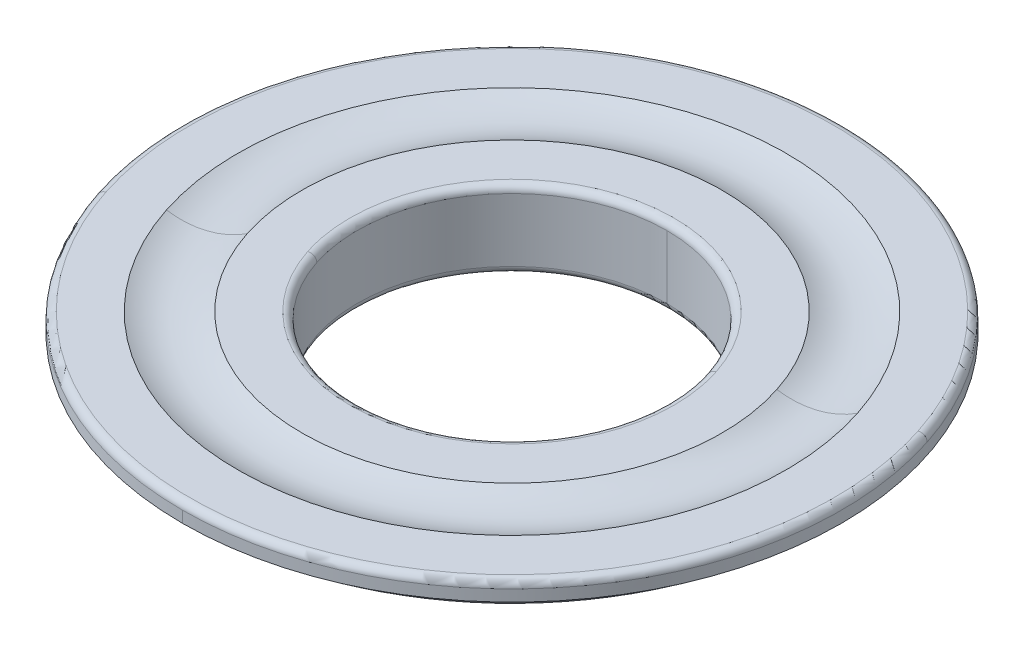
ISO-10303-21;
HEADER;
FILE_DESCRIPTION(('STEP AP214'),'2;1');
FILE_NAME('part.step','',(''),(''),'','','');
FILE_SCHEMA(('AUTOMOTIVE_DESIGN { 1 0 10303 214 1 1 1 1 }'));
ENDSEC;
DATA;
#1=APPLICATION_CONTEXT('core data for automotive mechanical design processes');
#2=APPLICATION_PROTOCOL_DEFINITION('international standard','automotive_design',2000,#1);
#3=PRODUCT_CONTEXT('',#1,'mechanical');
#4=PRODUCT('Part','Part','',(#3));
#5=PRODUCT_RELATED_PRODUCT_CATEGORY('part','',(#4));
#6=PRODUCT_DEFINITION_FORMATION('','',#4);
#7=PRODUCT_DEFINITION_CONTEXT('part definition',#1,'design');
#8=PRODUCT_DEFINITION('design','',#6,#7);
#9=PRODUCT_DEFINITION_SHAPE('','',#8);
#10=(LENGTH_UNIT() NAMED_UNIT(*) SI_UNIT(.MILLI.,.METRE.));
#11=(NAMED_UNIT(*) PLANE_ANGLE_UNIT() SI_UNIT($,.RADIAN.));
#12=(NAMED_UNIT(*) SI_UNIT($,.STERADIAN.) SOLID_ANGLE_UNIT());
#13=UNCERTAINTY_MEASURE_WITH_UNIT(LENGTH_MEASURE(1.E-05),#10,'distance_accuracy_value','');
#14=(GEOMETRIC_REPRESENTATION_CONTEXT(3) GLOBAL_UNCERTAINTY_ASSIGNED_CONTEXT((#13)) GLOBAL_UNIT_ASSIGNED_CONTEXT((#10,
#11,#12)) REPRESENTATION_CONTEXT('',''));
#15=CARTESIAN_POINT('',(0.,0.,0.));
#16=DIRECTION('',(0.,0.,1.));
#17=DIRECTION('',(1.,0.,0.));
#18=AXIS2_PLACEMENT_3D('',#15,#16,#17);
#19=CARTESIAN_POINT('',(-36.083791375076,0.,0.));
#20=DIRECTION('',(0.,-1.,0.));
#21=DIRECTION('',(0.,0.,-1.));
#22=AXIS2_PLACEMENT_3D('',#19,#20,#21);
#23=PLANE('',#22);
#24=CARTESIAN_POINT('',(0.,0.,0.));
#25=DIRECTION('',(0.,1.,0.));
#26=DIRECTION('',(0.,0.,1.));
#27=AXIS2_PLACEMENT_3D('',#24,#25,#26);
#28=CIRCLE('',#27,24.6);
#29=CARTESIAN_POINT('',(23.3959903008611,0.,-7.60181806162381));
#30=VERTEX_POINT('',#29);
#31=CARTESIAN_POINT('',(-23.3959903008611,0.,7.60181806162381));
#32=VERTEX_POINT('',#31);
#33=EDGE_CURVE('E11',#30,#32,#28,.T.);
#34=ORIENTED_EDGE('',*,*,#33,.T.);
#35=CARTESIAN_POINT('',(-23.3959903008608,0.,7.6018180616237));
#36=CARTESIAN_POINT('',(-22.2018510126811,0.,11.2768172380102));
#37=CARTESIAN_POINT('',(-20.286424526131,0.,14.7175705841354));
#38=CARTESIAN_POINT('',(-17.7097835020012,0.,17.734267025429));
#39=CARTESIAN_POINT('',(-11.512552889599,0.,22.5946486259766));
#40=CARTESIAN_POINT('',(-3.93777589317228,0.,24.7514777027532));
#41=CARTESIAN_POINT('',(0.0173134109549208,0.,25.0627567260904));
#42=CARTESIAN_POINT('',(7.83622344692157,0.,24.1174158962172));
#43=CARTESIAN_POINT('',(14.7175119416968,0.,20.2863726849183));
#44=CARTESIAN_POINT('',(17.7342811837407,0.,17.7097995005804));
#45=CARTESIAN_POINT('',(22.5946521794054,0.,11.5125459156023));
#46=CARTESIAN_POINT('',(24.7514564375839,0.,3.93777384258645));
#47=CARTESIAN_POINT('',(25.0628331356729,0.,-0.0172964397257402));
#48=CARTESIAN_POINT('',(24.5900216411396,0.,-3.92678381083807));
#49=CARTESIAN_POINT('',(23.3959903008608,0.,-7.6018180616237));
#50=B_SPLINE_CURVE_WITH_KNOTS('',5,(#35,#36,#37,#38,#39,#40,#41,#42,#43,#44,#45,#46,#47,#48,
#49),.UNSPECIFIED.,.F.,.F.,(6,3,3,3,6),(0.,0.785398163397448,1.5707963267949,2.35619449019234,
3.14159265358979),.UNSPECIFIED.);
#51=EDGE_CURVE('E26',#32,#30,#50,.T.);
#52=ORIENTED_EDGE('',*,*,#51,.T.);
#53=EDGE_LOOP('',(#34,#52));
#54=FACE_BOUND('',#53,.T.);
#55=CARTESIAN_POINT('',(0.,0.,0.));
#56=DIRECTION('',(0.,1.,0.));
#57=DIRECTION('',(0.,0.,1.));
#58=AXIS2_PLACEMENT_3D('',#55,#56,#57);
#59=CIRCLE('',#58,36.083791375076);
#60=CARTESIAN_POINT('',(36.0837913750529,7.67386154620908E-12,0.));
#61=VERTEX_POINT('',#60);
#62=CARTESIAN_POINT('',(-36.0837913750913,7.67386154620908E-12,0.));
#63=VERTEX_POINT('',#62);
#64=EDGE_CURVE('E393',#61,#63,#59,.T.);
#65=ORIENTED_EDGE('',*,*,#64,.F.);
#66=CARTESIAN_POINT('',(0.,0.,0.));
#67=DIRECTION('',(0.,1.,0.));
#68=DIRECTION('',(-1.,0.,0.));
#69=AXIS2_PLACEMENT_3D('',#66,#67,#68);
#70=CIRCLE('',#69,36.083791375076);
#71=EDGE_CURVE('E388',#63,#61,#70,.T.);
#72=ORIENTED_EDGE('',*,*,#71,.F.);
#73=EDGE_LOOP('',(#65,#72));
#74=FACE_BOUND('',#73,.T.);
#75=ADVANCED_FACE('F17',(#54,#74),#23,.T.);
#76=CARTESIAN_POINT('',(-1.92068583260152E-11,71.3999999999698,0.));
#77=DIRECTION('',(0.,1.,0.));
#78=DIRECTION('',(0.,0.,-1.));
#79=AXIS2_PLACEMENT_3D('',#76,#77,#78);
#80=SPHERICAL_SURFACE('',#79,79.9999999999645);
#81=CARTESIAN_POINT('',(-1.92068583260152E-11,71.3999999999698,0.));
#82=DIRECTION('',(0.,0.,-1.));
#83=DIRECTION('',(0.625000000000184,-0.780624749799652,0.));
#84=AXIS2_PLACEMENT_3D('',#81,#82,#83);
#85=CIRCLE('',#84,79.9999999999645);
#86=CARTESIAN_POINT('',(49.9999999999733,8.95002001602532,0.));
#87=VERTEX_POINT('',#86);
#88=EDGE_CURVE('E383',#87,#61,#85,.T.);
#89=ORIENTED_EDGE('',*,*,#88,.F.);
#90=CARTESIAN_POINT('',(0.,8.950020016016,0.));
#91=DIRECTION('',(0.,1.,0.));
#92=DIRECTION('',(0.,0.,1.));
#93=AXIS2_PLACEMENT_3D('',#90,#91,#92);
#94=CIRCLE('',#93,50.);
#95=CARTESIAN_POINT('',(0.,8.950020016016,50.));
#96=VERTEX_POINT('',#95);
#97=EDGE_CURVE('E378',#96,#87,#94,.T.);
#98=ORIENTED_EDGE('',*,*,#97,.F.);
#99=CARTESIAN_POINT('',(0.,8.950020016016,0.));
#100=DIRECTION('',(0.,1.,0.));
#101=DIRECTION('',(0.,0.,1.));
#102=AXIS2_PLACEMENT_3D('',#99,#100,#101);
#103=CIRCLE('',#102,50.);
#104=CARTESIAN_POINT('',(-50.0000000000118,8.95002001602532,0.));
#105=VERTEX_POINT('',#104);
#106=EDGE_CURVE('E373',#105,#96,#103,.T.);
#107=ORIENTED_EDGE('',*,*,#106,.F.);
#108=CARTESIAN_POINT('',(-1.92068583260152E-11,71.3999999999698,0.));
#109=DIRECTION('',(0.,0.,1.));
#110=DIRECTION('',(-0.625000000000184,-0.780624749799652,0.));
#111=AXIS2_PLACEMENT_3D('',#108,#109,#110);
#112=CIRCLE('',#111,79.9999999999645);
#113=EDGE_CURVE('E368',#105,#63,#112,.T.);
#114=ORIENTED_EDGE('',*,*,#113,.T.);
#115=ORIENTED_EDGE('',*,*,#71,.T.);
#116=EDGE_LOOP('',(#89,#98,#107,#114,#115));
#117=FACE_BOUND('',#116,.T.);
#118=ADVANCED_FACE('F413',(#117),#80,.T.);
#119=CARTESIAN_POINT('',(-1.92068583260152E-11,71.3999999999698,0.));
#120=DIRECTION('',(0.,1.,0.));
#121=DIRECTION('',(0.,0.,1.));
#122=AXIS2_PLACEMENT_3D('',#119,#120,#121);
#123=SPHERICAL_SURFACE('',#122,79.9999999999645);
#124=ORIENTED_EDGE('',*,*,#88,.T.);
#125=ORIENTED_EDGE('',*,*,#64,.T.);
#126=ORIENTED_EDGE('',*,*,#113,.F.);
#127=CARTESIAN_POINT('',(0.,8.950020016016,0.));
#128=DIRECTION('',(0.,1.,0.));
#129=DIRECTION('',(0.,0.,1.));
#130=AXIS2_PLACEMENT_3D('',#127,#128,#129);
#131=CIRCLE('',#130,50.);
#132=CARTESIAN_POINT('',(0.,8.950020016016,-50.));
#133=VERTEX_POINT('',#132);
#134=EDGE_CURVE('E363',#133,#105,#131,.T.);
#135=ORIENTED_EDGE('',*,*,#134,.F.);
#136=CARTESIAN_POINT('',(0.,8.950020016016,0.));
#137=DIRECTION('',(0.,1.,0.));
#138=DIRECTION('',(0.,0.,1.));
#139=AXIS2_PLACEMENT_3D('',#136,#137,#138);
#140=CIRCLE('',#139,50.);
#141=EDGE_CURVE('E358',#87,#133,#140,.T.);
#142=ORIENTED_EDGE('',*,*,#141,.F.);
#143=EDGE_LOOP('',(#124,#125,#126,#135,#142));
#144=FACE_BOUND('',#143,.T.);
#145=ADVANCED_FACE('F409',(#144),#123,.T.);
#146=CARTESIAN_POINT('',(0.,11.777777777778,0.));
#147=DIRECTION('',(0.,1.,0.));
#148=DIRECTION('',(-1.,0.,0.));
#149=AXIS2_PLACEMENT_3D('',#146,#147,#148);
#150=CYLINDRICAL_SURFACE('',#149,50.);
#151=DIRECTION('',(0.,1.,0.));
#152=VECTOR('',#151,1.);
#153=CARTESIAN_POINT('',(0.,8.950020016016,-50.));
#154=LINE('',#153,#152);
#155=CARTESIAN_POINT('',(0.,10.677777777778,-50.));
#156=VERTEX_POINT('',#155);
#157=EDGE_CURVE('E354',#133,#156,#154,.T.);
#158=ORIENTED_EDGE('',*,*,#157,.T.);
#159=CARTESIAN_POINT('',(0.,10.677777777778,0.));
#160=DIRECTION('',(0.,1.,0.));
#161=DIRECTION('',(0.,0.,1.));
#162=AXIS2_PLACEMENT_3D('',#159,#160,#161);
#163=CIRCLE('',#162,50.);
#164=CARTESIAN_POINT('',(47.5528258147577,10.677777777778,-15.4508497187474));
#165=VERTEX_POINT('',#164);
#166=EDGE_CURVE('E349',#165,#156,#163,.T.);
#167=ORIENTED_EDGE('',*,*,#166,.F.);
#168=CARTESIAN_POINT('',(0.,10.677777777778,0.));
#169=DIRECTION('',(0.,1.,0.));
#170=DIRECTION('',(0.,0.,1.));
#171=AXIS2_PLACEMENT_3D('',#168,#169,#170);
#172=CIRCLE('',#171,50.);
#173=CARTESIAN_POINT('',(0.,10.677777777778,50.));
#174=VERTEX_POINT('',#173);
#175=EDGE_CURVE('E344',#174,#165,#172,.T.);
#176=ORIENTED_EDGE('',*,*,#175,.F.);
#177=DIRECTION('',(0.,1.,0.));
#178=VECTOR('',#177,1.);
#179=CARTESIAN_POINT('',(0.,8.950020016016,50.));
#180=LINE('',#179,#178);
#181=EDGE_CURVE('E339',#96,#174,#180,.T.);
#182=ORIENTED_EDGE('',*,*,#181,.F.);
#183=ORIENTED_EDGE('',*,*,#97,.T.);
#184=ORIENTED_EDGE('',*,*,#141,.T.);
#185=EDGE_LOOP('',(#158,#167,#176,#182,#183,#184));
#186=FACE_BOUND('',#185,.T.);
#187=ADVANCED_FACE('F420',(#186),#150,.T.);
#188=CARTESIAN_POINT('',(0.,11.777777777778,0.));
#189=DIRECTION('',(0.,1.,0.));
#190=DIRECTION('',(1.,0.,0.));
#191=AXIS2_PLACEMENT_3D('',#188,#189,#190);
#192=CYLINDRICAL_SURFACE('',#191,50.);
#193=ORIENTED_EDGE('',*,*,#157,.F.);
#194=ORIENTED_EDGE('',*,*,#134,.T.);
#195=ORIENTED_EDGE('',*,*,#106,.T.);
#196=ORIENTED_EDGE('',*,*,#181,.T.);
#197=CARTESIAN_POINT('',(0.,10.677777777778,0.));
#198=DIRECTION('',(0.,1.,0.));
#199=DIRECTION('',(0.,0.,1.));
#200=AXIS2_PLACEMENT_3D('',#197,#198,#199);
#201=CIRCLE('',#200,50.);
#202=CARTESIAN_POINT('',(-47.5528258147577,10.677777777778,15.4508497187474));
#203=VERTEX_POINT('',#202);
#204=EDGE_CURVE('E334',#203,#174,#201,.T.);
#205=ORIENTED_EDGE('',*,*,#204,.F.);
#206=CARTESIAN_POINT('',(0.,10.677777777778,0.));
#207=DIRECTION('',(0.,1.,0.));
#208=DIRECTION('',(0.,0.,1.));
#209=AXIS2_PLACEMENT_3D('',#206,#207,#208);
#210=CIRCLE('',#209,50.);
#211=EDGE_CURVE('E329',#156,#203,#210,.T.);
#212=ORIENTED_EDGE('',*,*,#211,.F.);
#213=EDGE_LOOP('',(#193,#194,#195,#196,#205,#212));
#214=FACE_BOUND('',#213,.T.);
#215=ADVANCED_FACE('F417',(#214),#192,.T.);
#216=CARTESIAN_POINT('',(0.,10.6777777777773,0.));
#217=DIRECTION('',(0.,1.,0.));
#218=DIRECTION('',(0.309016994374947,0.,0.951056516295154));
#219=AXIS2_PLACEMENT_3D('',#216,#217,#218);
#220=TOROIDAL_SURFACE('',#219,48.8999999999993,1.1000000000007);
#221=CARTESIAN_POINT('',(-46.5066636468323,10.6777777777773,15.1109310249347));
#222=DIRECTION('',(0.309016994374947,0.,0.951056516295154));
#223=DIRECTION('',(0.,1.,0.));
#224=AXIS2_PLACEMENT_3D('',#221,#222,#223);
#225=CIRCLE('',#224,1.1000000000007);
#226=CARTESIAN_POINT('',(-46.5066636468323,11.777777777778,15.1109310249347));
#227=VERTEX_POINT('',#226);
#228=EDGE_CURVE('E325',#227,#203,#225,.T.);
#229=ORIENTED_EDGE('',*,*,#228,.F.);
#230=CARTESIAN_POINT('',(0.,11.777777777778,0.));
#231=DIRECTION('',(0.,1.,0.));
#232=DIRECTION('',(0.,0.,1.));
#233=AXIS2_PLACEMENT_3D('',#230,#231,#232);
#234=CIRCLE('',#233,48.9);
#235=CARTESIAN_POINT('',(46.5066636468323,11.777777777778,-15.1109310249347));
#236=VERTEX_POINT('',#235);
#237=EDGE_CURVE('E321',#236,#227,#234,.T.);
#238=ORIENTED_EDGE('',*,*,#237,.F.);
#239=CARTESIAN_POINT('',(46.5066636468323,10.6777777777773,-15.1109310249347));
#240=DIRECTION('',(-0.309016994374947,0.,-0.951056516295154));
#241=DIRECTION('',(0.,1.,0.));
#242=AXIS2_PLACEMENT_3D('',#239,#240,#241);
#243=CIRCLE('',#242,1.1000000000007);
#244=EDGE_CURVE('E318',#236,#165,#243,.T.);
#245=ORIENTED_EDGE('',*,*,#244,.T.);
#246=ORIENTED_EDGE('',*,*,#166,.T.);
#247=ORIENTED_EDGE('',*,*,#211,.T.);
#248=EDGE_LOOP('',(#229,#238,#245,#246,#247));
#249=FACE_BOUND('',#248,.T.);
#250=ADVANCED_FACE('F302',(#249),#220,.T.);
#251=CARTESIAN_POINT('',(0.,10.6777777777773,0.));
#252=DIRECTION('',(0.,1.,0.));
#253=DIRECTION('',(-0.309016994374947,0.,-0.951056516295154));
#254=AXIS2_PLACEMENT_3D('',#251,#252,#253);
#255=TOROIDAL_SURFACE('',#254,48.8999999999993,1.1000000000007);
#256=ORIENTED_EDGE('',*,*,#228,.T.);
#257=ORIENTED_EDGE('',*,*,#204,.T.);
#258=ORIENTED_EDGE('',*,*,#175,.T.);
#259=ORIENTED_EDGE('',*,*,#244,.F.);
#260=CARTESIAN_POINT('',(-46.506663646833,11.777777777778,15.1109310249349));
#261=CARTESIAN_POINT('',(-44.1329477447198,11.777777777778,22.4161123145812));
#262=CARTESIAN_POINT('',(-40.3254536312116,11.777777777778,29.2556586001716));
#263=CARTESIAN_POINT('',(-35.2035940344658,11.777777777778,35.2522625017673));
#264=CARTESIAN_POINT('',(-22.8847087927394,11.777777777778,44.9137527565145));
#265=CARTESIAN_POINT('',(-7.82753012911076,11.777777777778,49.2011081164484));
#266=CARTESIAN_POINT('',(0.0344156827518094,11.777777777778,49.8198700774724));
#267=CARTESIAN_POINT('',(15.5768831932709,11.777777777778,47.9407169644317));
#268=CARTESIAN_POINT('',(29.2555420304461,11.777777777778,40.3253505809962));
#269=CARTESIAN_POINT('',(35.2522906457284,11.777777777778,35.2036258365196));
#270=CARTESIAN_POINT('',(44.9137598200377,11.777777777778,22.8846949297948));
#271=CARTESIAN_POINT('',(49.2010658454412,11.777777777778,7.82752605294624));
#272=CARTESIAN_POINT('',(49.8200219648134,11.777777777778,-0.0343819472596962));
#273=CARTESIAN_POINT('',(48.8801649695824,11.777777777778,-7.80568001422689));
#274=CARTESIAN_POINT('',(46.506663646833,11.777777777778,-15.1109310249349));
#275=B_SPLINE_CURVE_WITH_KNOTS('',5,(#260,#261,#262,#263,#264,#265,#266,#267,#268,#269,#270,
#271,#272,#273,#274),.UNSPECIFIED.,.F.,.F.,(6,3,3,3,6),(0.,0.785398163397448,1.5707963267949,
2.35619449019234,3.14159265358979),.UNSPECIFIED.);
#276=EDGE_CURVE('E277',#227,#236,#275,.T.);
#277=ORIENTED_EDGE('',*,*,#276,.F.);
#278=EDGE_LOOP('',(#256,#257,#258,#259,#277));
#279=FACE_BOUND('',#278,.T.);
#280=ADVANCED_FACE('F297',(#279),#255,.T.);
#281=CARTESIAN_POINT('',(-41.606102181283,11.777777777778,0.));
#282=DIRECTION('',(0.,1.,0.));
#283=DIRECTION('',(0.,0.,1.));
#284=AXIS2_PLACEMENT_3D('',#281,#282,#283);
#285=PLANE('',#284);
#286=ORIENTED_EDGE('',*,*,#237,.T.);
#287=ORIENTED_EDGE('',*,*,#276,.T.);
#288=EDGE_LOOP('',(#286,#287));
#289=FACE_BOUND('',#288,.T.);
#290=CARTESIAN_POINT('',(0.,11.777777777778,0.));
#291=DIRECTION('',(0.,1.,0.));
#292=DIRECTION('',(-0.951056516295154,0.,0.309016994374947));
#293=AXIS2_PLACEMENT_3D('',#290,#291,#292);
#294=CIRCLE('',#293,41.606102181283);
#295=CARTESIAN_POINT('',(-39.5697545971512,11.777777777778,12.856992643717));
#296=VERTEX_POINT('',#295);
#297=CARTESIAN_POINT('',(39.5697545971512,11.777777777778,-12.856992643717));
#298=VERTEX_POINT('',#297);
#299=EDGE_CURVE('E272',#296,#298,#294,.T.);
#300=ORIENTED_EDGE('',*,*,#299,.F.);
#301=CARTESIAN_POINT('',(0.,11.777777777778,0.));
#302=DIRECTION('',(0.,1.,0.));
#303=DIRECTION('',(0.,0.,1.));
#304=AXIS2_PLACEMENT_3D('',#301,#302,#303);
#305=CIRCLE('',#304,41.606102181283);
#306=EDGE_CURVE('E267',#298,#296,#305,.T.);
#307=ORIENTED_EDGE('',*,*,#306,.F.);
#308=EDGE_LOOP('',(#300,#307));
#309=FACE_BOUND('',#308,.T.);
#310=ADVANCED_FACE('F286',(#289,#309),#285,.T.);
#311=CARTESIAN_POINT('',(0.,21.1999999999982,0.));
#312=DIRECTION('',(0.,1.,0.));
#313=DIRECTION('',(0.309016994374947,0.,0.951056516295154));
#314=AXIS2_PLACEMENT_3D('',#311,#312,#313);
#315=TOROIDAL_SURFACE('',#314,36.75,10.5999999999981);
#316=CARTESIAN_POINT('',(-34.9513269738469,21.1999999999982,11.3563745432793));
#317=DIRECTION('',(0.309016994374947,0.,0.951056516295154));
#318=DIRECTION('',(-0.435700719179726,-0.88888888888885,0.141567745324335));
#319=AXIS2_PLACEMENT_3D('',#316,#317,#318);
#320=CIRCLE('',#319,10.5999999999981);
#321=CARTESIAN_POINT('',(-30.3328993505426,11.777777777778,9.85575644284161));
#322=VERTEX_POINT('',#321);
#323=EDGE_CURVE('E263',#296,#322,#320,.T.);
#324=ORIENTED_EDGE('',*,*,#323,.T.);
#325=CARTESIAN_POINT('',(0.,11.777777777778,0.));
#326=DIRECTION('',(0.,1.,0.));
#327=DIRECTION('',(0.,0.,1.));
#328=AXIS2_PLACEMENT_3D('',#325,#326,#327);
#329=CIRCLE('',#328,31.893897818717);
#330=CARTESIAN_POINT('',(30.3328993505426,11.777777777778,-9.85575644284162));
#331=VERTEX_POINT('',#330);
#332=EDGE_CURVE('E258',#331,#322,#329,.T.);
#333=ORIENTED_EDGE('',*,*,#332,.F.);
#334=CARTESIAN_POINT('',(34.9513269738469,21.1999999999982,-11.3563745432793));
#335=DIRECTION('',(-0.309016994374947,0.,-0.951056516295154));
#336=DIRECTION('',(0.435700719179727,-0.888888888888849,-0.141567745324335));
#337=AXIS2_PLACEMENT_3D('',#334,#335,#336);
#338=CIRCLE('',#337,10.5999999999981);
#339=EDGE_CURVE('E253',#298,#331,#338,.T.);
#340=ORIENTED_EDGE('',*,*,#339,.F.);
#341=ORIENTED_EDGE('',*,*,#306,.T.);
#342=EDGE_LOOP('',(#324,#333,#340,#341));
#343=FACE_BOUND('',#342,.T.);
#344=ADVANCED_FACE('F296',(#343),#315,.F.);
#345=CARTESIAN_POINT('',(0.,21.1999999999982,0.));
#346=DIRECTION('',(0.,1.,0.));
#347=DIRECTION('',(-0.309016994374947,0.,-0.951056516295154));
#348=AXIS2_PLACEMENT_3D('',#345,#346,#347);
#349=TOROIDAL_SURFACE('',#348,36.75,10.5999999999981);
#350=ORIENTED_EDGE('',*,*,#323,.F.);
#351=ORIENTED_EDGE('',*,*,#299,.T.);
#352=ORIENTED_EDGE('',*,*,#339,.T.);
#353=CARTESIAN_POINT('',(0.,11.777777777778,0.));
#354=DIRECTION('',(0.,1.,0.));
#355=DIRECTION('',(-0.951056516295154,0.,0.309016994374947));
#356=AXIS2_PLACEMENT_3D('',#353,#354,#355);
#357=CIRCLE('',#356,31.893897818717);
#358=EDGE_CURVE('E250',#322,#331,#357,.T.);
#359=ORIENTED_EDGE('',*,*,#358,.F.);
#360=EDGE_LOOP('',(#350,#351,#352,#359));
#361=FACE_BOUND('',#360,.T.);
#362=ADVANCED_FACE('F427',(#361),#349,.F.);
#363=CARTESIAN_POINT('',(-24.6,11.777777777778,0.));
#364=DIRECTION('',(0.,1.,0.));
#365=DIRECTION('',(0.,0.,1.));
#366=AXIS2_PLACEMENT_3D('',#363,#364,#365);
#367=PLANE('',#366);
#368=ORIENTED_EDGE('',*,*,#332,.T.);
#369=ORIENTED_EDGE('',*,*,#358,.T.);
#370=EDGE_LOOP('',(#368,#369));
#371=FACE_BOUND('',#370,.T.);
#372=CARTESIAN_POINT('',(-23.3959903008614,11.777777777778,7.60181806162396));
#373=CARTESIAN_POINT('',(-23.2716138385705,11.777777777778,7.98463708281952));
#374=CARTESIAN_POINT('',(-23.1378259307744,11.777777777778,8.36439737607865));
#375=CARTESIAN_POINT('',(-22.8517846151789,11.777777777778,9.1168989669184));
#376=CARTESIAN_POINT('',(-22.6995312073796,11.777777777778,9.48964026449902));
#377=CARTESIAN_POINT('',(-22.3769162827848,11.777777777778,10.2272023241761));
#378=CARTESIAN_POINT('',(-22.2065547659893,11.777777777778,10.5920230862726));
#379=CARTESIAN_POINT('',(-21.8481365581518,11.777777777778,11.3128661472931));
#380=CARTESIAN_POINT('',(-21.6600798671097,11.777777777778,11.668888446217));
#381=CARTESIAN_POINT('',(-21.2667236808731,11.777777777778,12.3712766354339));
#382=CARTESIAN_POINT('',(-21.0614241856787,11.777777777778,12.7176425257268));
#383=CARTESIAN_POINT('',(-20.6340771564548,11.777777777778,13.3998835406579));
#384=CARTESIAN_POINT('',(-20.4120296224254,11.777777777778,13.735758665296));
#385=CARTESIAN_POINT('',(-19.951721399031,11.777777777778,14.3962089779033));
#386=CARTESIAN_POINT('',(-19.7134607096662,11.777777777778,14.7207841658724));
#387=CARTESIAN_POINT('',(-19.2213001794554,11.777777777778,15.3578526800199));
#388=CARTESIAN_POINT('',(-18.9674003386095,11.777777777778,15.6703460061982));
#389=CARTESIAN_POINT('',(-18.4445731689131,11.777777777778,16.2824979716478));
#390=CARTESIAN_POINT('',(-18.1756458400625,11.777777777778,16.582156610919));
#391=CARTESIAN_POINT('',(-17.6234115647795,11.777777777778,17.1679172989995));
#392=CARTESIAN_POINT('',(-17.3401046183471,11.777777777778,17.4540193478089));
#393=CARTESIAN_POINT('',(-16.7597936188991,11.777777777778,18.0119776099757));
#394=CARTESIAN_POINT('',(-16.4627895658837,11.777777777778,18.2838338233332));
#395=CARTESIAN_POINT('',(-15.8557998621149,11.777777777778,18.8126454891919));
#396=CARTESIAN_POINT('',(-15.5458142113615,11.777777777778,19.0696009416931));
#397=CARTESIAN_POINT('',(-14.9136080946832,11.777777777778,19.5679920576407));
#398=CARTESIAN_POINT('',(-14.5913876287582,11.777777777778,19.8094277210871));
#399=CARTESIAN_POINT('',(-13.9354881390671,11.777777777778,20.2761976192665));
#400=CARTESIAN_POINT('',(-13.6018091153009,11.777777777778,20.5015318539995));
#401=CARTESIAN_POINT('',(-12.9237963719211,11.777777777778,20.935556044843));
#402=CARTESIAN_POINT('',(-12.5794626523075,11.777777777778,21.1442460009536));
#403=CARTESIAN_POINT('',(-11.8809700473238,11.777777777778,21.5444788821692));
#404=CARTESIAN_POINT('',(-11.5268111619537,11.777777777778,21.7360218072742));
#405=CARTESIAN_POINT('',(-10.8095214252326,11.777777777778,22.1014991827948));
#406=CARTESIAN_POINT('',(-10.4463905738815,11.777777777778,22.2754336332104));
#407=CARTESIAN_POINT('',(-9.71203171922568,11.777777777778,22.6052750360263));
#408=CARTESIAN_POINT('',(-9.34080371592098,11.777777777778,22.7611819884266));
#409=CARTESIAN_POINT('',(-8.59114487813367,11.777777777778,23.0545928017078));
#410=CARTESIAN_POINT('',(-8.21271404365106,11.777777777778,23.1920966625887));
#411=CARTESIAN_POINT('',(-7.44956121653482,11.777777777778,23.4483700339862));
#412=CARTESIAN_POINT('',(-7.0648392239012,11.777777777778,23.5671395445028));
#413=CARTESIAN_POINT('',(-6.29003090946084,11.777777777778,23.785658089018));
#414=CARTESIAN_POINT('',(-5.89994458765412,11.777777777778,23.8854071230166));
#415=CARTESIAN_POINT('',(-5.11534736698433,11.777777777778,24.0656444103358));
#416=CARTESIAN_POINT('',(-4.72083646812127,11.777777777778,24.1461326636564));
#417=CARTESIAN_POINT('',(-3.92834050464924,11.777777777778,24.2876544863676));
#418=CARTESIAN_POINT('',(-3.53035544004028,11.777777777778,24.3486880557581));
#419=CARTESIAN_POINT('',(-2.73186992595646,11.777777777778,24.4511534753945));
#420=CARTESIAN_POINT('',(-2.3313694764816,11.777777777778,24.4925853256403));
#421=CARTESIAN_POINT('',(-1.52881803332849,11.777777777778,24.555747494031));
#422=CARTESIAN_POINT('',(-1.12676703965023,11.777777777778,24.5774778121759));
#423=CARTESIAN_POINT('',(-0.322083084149601,11.777777777778,24.601184566125));
#424=CARTESIAN_POINT('',(0.0805498776727745,11.777777777778,24.6031610019291));
#425=CARTESIAN_POINT('',(0.885427791390145,11.777777777778,24.5873552297898));
#426=CARTESIAN_POINT('',(1.28767274328514,11.777777777778,24.5695730218464));
#427=CARTESIAN_POINT('',(2.09080559382612,11.777777777778,24.5142928011082));
#428=CARTESIAN_POINT('',(2.49169349247211,11.777777777778,24.4767947883135));
#429=CARTESIAN_POINT('',(3.29114646245362,11.777777777778,24.3821732938702));
#430=CARTESIAN_POINT('',(3.68971153378915,11.777777777778,24.3250498122216));
#431=CARTESIAN_POINT('',(4.4835586709827,11.777777777778,24.1913149955412));
#432=CARTESIAN_POINT('',(4.87884073684073,11.777777777778,24.1147036605094));
#433=CARTESIAN_POINT('',(5.66516959396002,11.777777777778,23.9421777004789));
#434=CARTESIAN_POINT('',(6.05621638522129,11.777777777778,23.8462630754804));
#435=CARTESIAN_POINT('',(6.83313262717524,11.777777777778,23.6353616022492));
#436=CARTESIAN_POINT('',(7.21900207786793,11.777777777778,23.5203747540165));
#437=CARTESIAN_POINT('',(7.98463404537986,11.777777777778,23.2716058477064));
#438=CARTESIAN_POINT('',(8.36439656219909,11.777777777778,23.1378237896288));
#439=CARTESIAN_POINT('',(9.11689978079782,11.777777777778,22.8517867563245));
#440=CARTESIAN_POINT('',(9.48964048257731,11.777777777778,22.6995317810978));
#441=CARTESIAN_POINT('',(10.2272021060977,11.777777777778,22.3769157090666));
#442=CARTESIAN_POINT('',(10.5920230278387,11.777777777778,22.206554612262));
#443=CARTESIAN_POINT('',(11.3128662057269,11.777777777778,21.8481367118792));
#444=CARTESIAN_POINT('',(11.6688884618743,11.777777777778,21.6600799083008));
#445=CARTESIAN_POINT('',(12.3712766197765,11.777777777778,21.2667236396821));
#446=CARTESIAN_POINT('',(12.7176425215314,11.777777777778,21.0614241746416));
#447=CARTESIAN_POINT('',(13.3998835448532,11.777777777778,20.634077167492));
#448=CARTESIAN_POINT('',(13.7357586664201,11.777777777778,20.4120296253828));
#449=CARTESIAN_POINT('',(14.3962089767791,11.777777777778,19.9517213960737));
#450=CARTESIAN_POINT('',(14.7207841655711,11.777777777778,19.7134607088738));
#451=CARTESIAN_POINT('',(15.357852680321,11.777777777778,19.2213001802479));
#452=CARTESIAN_POINT('',(15.6703460062789,11.777777777778,18.9674003388219));
#453=CARTESIAN_POINT('',(16.282497971567,11.777777777778,18.4445731687008));
#454=CARTESIAN_POINT('',(16.5821566108973,11.777777777778,18.1756458400057));
#455=CARTESIAN_POINT('',(17.1679172990211,11.777777777778,17.6234115648365));
#456=CARTESIAN_POINT('',(17.4540193478147,11.777777777778,17.3401046183624));
#457=CARTESIAN_POINT('',(18.0119776099699,11.777777777778,16.759793618884));
#458=CARTESIAN_POINT('',(18.2838338233316,11.777777777778,16.4627895658796));
#459=CARTESIAN_POINT('',(18.8126454891934,11.777777777778,15.855799862119));
#460=CARTESIAN_POINT('',(19.0696009416934,11.777777777778,15.5458142113627));
#461=CARTESIAN_POINT('',(19.5679920576402,11.777777777778,14.9136080946821));
#462=CARTESIAN_POINT('',(19.809427721087,11.777777777778,14.591387628758));
#463=CARTESIAN_POINT('',(20.2761976192666,11.777777777778,13.9354881390674));
#464=CARTESIAN_POINT('',(20.5015318539995,11.777777777778,13.601809115301));
#465=CARTESIAN_POINT('',(20.935556044843,11.777777777778,12.9237963719211));
#466=CARTESIAN_POINT('',(21.1442460009536,11.777777777778,12.5794626523075));
#467=CARTESIAN_POINT('',(21.5444788821692,11.777777777778,11.8809700473239));
#468=CARTESIAN_POINT('',(21.7360218072742,11.777777777778,11.5268111619538));
#469=CARTESIAN_POINT('',(22.1014991827947,11.777777777778,10.8095214252326));
#470=CARTESIAN_POINT('',(22.2754336332103,11.777777777778,10.4463905738815));
#471=CARTESIAN_POINT('',(22.6052750360263,11.777777777778,9.71203171922574));
#472=CARTESIAN_POINT('',(22.7611819884267,11.777777777778,9.34080371592102));
#473=CARTESIAN_POINT('',(23.0545928017077,11.777777777778,8.59114487813376));
#474=CARTESIAN_POINT('',(23.1920966625884,11.777777777778,8.21271404365121));
#475=CARTESIAN_POINT('',(23.4483700339864,11.777777777778,7.4495612165348));
#476=CARTESIAN_POINT('',(23.5671395445039,11.777777777778,7.06483922390095));
#477=CARTESIAN_POINT('',(23.7856580890169,11.777777777778,6.29003090946121));
#478=CARTESIAN_POINT('',(23.8854071230123,11.777777777778,5.89994458765533));
#479=CARTESIAN_POINT('',(24.06564441034,11.777777777778,5.11534736698325));
#480=CARTESIAN_POINT('',(24.1461326636722,11.777777777778,4.72083646811706));
#481=CARTESIAN_POINT('',(24.2876544863519,11.777777777778,3.92834050465358));
#482=CARTESIAN_POINT('',(24.3486880556994,11.777777777778,3.53035544005629));
#483=CARTESIAN_POINT('',(24.4511534754532,11.777777777778,2.73186992594058));
#484=CARTESIAN_POINT('',(24.4925853258595,11.777777777778,2.33136947642217));
#485=CARTESIAN_POINT('',(24.5557474938118,11.777777777778,1.52881803338808));
#486=CARTESIAN_POINT('',(24.5774778113577,11.777777777778,1.12676703987241));
#487=CARTESIAN_POINT('',(24.6011845669431,11.777777777778,0.322083083927595));
#488=CARTESIAN_POINT('',(24.6031610049825,11.777777777778,-0.0805498785015494));
#489=CARTESIAN_POINT('',(24.5873552267365,11.777777777778,-0.885427790561205));
#490=CARTESIAN_POINT('',(24.5695730104512,11.777777777778,-1.28767274019172));
#491=CARTESIAN_POINT('',(24.5142928125034,11.777777777778,-2.09080559691938));
#492=CARTESIAN_POINT('',(24.476794830841,11.777777777778,-2.49169350401654));
#493=CARTESIAN_POINT('',(24.3821732513428,11.777777777778,-3.29114645090908));
#494=CARTESIAN_POINT('',(24.325049653507,11.777777777778,-3.68971149070446));
#495=CARTESIAN_POINT('',(24.1913151542558,11.777777777778,-4.48355871406727));
#496=CARTESIAN_POINT('',(24.1147042528404,11.777777777778,-4.87884089763469));
#497=CARTESIAN_POINT('',(23.9421771081479,11.777777777778,-5.66516943316594));
#498=CARTESIAN_POINT('',(23.8462608648708,11.777777777778,-6.05621578512975));
#499=CARTESIAN_POINT('',(23.6353638128587,11.777777777778,-6.83313322726664));
#500=CARTESIAN_POINT('',(23.5203830041236,11.777777777778,-7.21900431743971));
#501=CARTESIAN_POINT('',(23.3959903008615,11.777777777778,-7.60181806162383));
#502=B_SPLINE_CURVE_WITH_KNOTS('',3,(#372,#373,#374,#375,#376,#377,#378,#379,#380,#381,#382,
#383,#384,#385,#386,#387,#388,#389,#390,#391,#392,#393,#394,#395,#396,#397,#398,#399,#400,#401,
#402,#403,#404,#405,#406,#407,#408,#409,#410,#411,#412,#413,#414,#415,#416,#417,#418,#419,#420,
#421,#422,#423,#424,#425,#426,#427,#428,#429,#430,#431,#432,#433,#434,#435,#436,#437,#438,#439,
#440,#441,#442,#443,#444,#445,#446,#447,#448,#449,#450,#451,#452,#453,#454,#455,#456,#457,#458,
#459,#460,#461,#462,#463,#464,#465,#466,#467,#468,#469,#470,#471,#472,#473,#474,#475,#476,#477,
#478,#479,#480,#481,#482,#483,#484,#485,#486,#487,#488,#489,#490,#491,#492,#493,#494,#495,#496,
#497,#498,#499,#500,#501),.UNSPECIFIED.,.F.,.F.,(4,2,2,2,2,2,2,2,2,2,2,2,2,2,2,2,2,2,2,2,2,2,2,
2,2,2,2,2,2,2,2,2,2,2,2,2,2,2,2,2,2,2,2,2,2,2,2,2,2,2,2,2,2,2,2,2,2,2,2,2,2,2,2,2,4),(0.,
1.20742844332731,2.41485688665463,3.62228532998195,4.82971377330927,6.03714221663658,
7.2445706599639,8.45199910329121,9.65942754661853,10.8668559899459,12.0742844332732,
13.2817128766005,14.4891413199278,15.6965697632551,16.9039982065824,18.1114266499097,
19.3188550932371,20.5262835365644,21.7337119798917,22.941140423219,24.1485688665463,
25.3559973098737,26.563425753201,27.7708541965283,28.9782826398556,30.1857110831829,
31.3931395265102,32.6005679698376,33.8079964131649,35.0154248564922,36.2228532998195,
37.4302817431468,38.6377101864741,39.8451386298014,41.0525670731288,42.2599955164561,
43.4674239597834,44.6748524031107,45.8822808464381,47.0897092897654,48.2971377330927,
49.50456617642,50.7119946197473,51.9194230630746,53.1268515064019,54.3342799497292,
55.5417083930566,56.7491368363839,57.9565652797112,59.1639937230385,60.3714221663658,
61.5788506096932,62.7862790530205,63.9937074963478,65.2011359396751,66.4085643830024,
67.6159928263297,68.823421269657,70.0308497129844,71.2382781563117,72.445706599639,
73.6531350429663,74.8605634862936,76.0679919296209,77.2754203729483),.UNSPECIFIED.);
#503=CARTESIAN_POINT('',(-23.3959903008614,11.777777777778,7.60181806162392));
#504=VERTEX_POINT('',#503);
#505=CARTESIAN_POINT('',(23.3959903008614,11.777777777778,-7.60181806162392));
#506=VERTEX_POINT('',#505);
#507=EDGE_CURVE('E249',#504,#506,#502,.T.);
#508=ORIENTED_EDGE('',*,*,#507,.F.);
#509=CARTESIAN_POINT('',(23.3959903008614,11.777777777778,-7.60181806162397));
#510=CARTESIAN_POINT('',(23.2716138385705,11.777777777778,-7.98463708281952));
#511=CARTESIAN_POINT('',(23.1378259307744,11.777777777778,-8.36439737607865));
#512=CARTESIAN_POINT('',(22.8517846151789,11.777777777778,-9.1168989669184));
#513=CARTESIAN_POINT('',(22.6995312073796,11.777777777778,-9.48964026449902));
#514=CARTESIAN_POINT('',(22.3769162827848,11.777777777778,-10.2272023241761));
#515=CARTESIAN_POINT('',(22.2065547659893,11.777777777778,-10.5920230862726));
#516=CARTESIAN_POINT('',(21.8481365581518,11.777777777778,-11.3128661472931));
#517=CARTESIAN_POINT('',(21.6600798671097,11.777777777778,-11.668888446217));
#518=CARTESIAN_POINT('',(21.2667236808731,11.777777777778,-12.3712766354339));
#519=CARTESIAN_POINT('',(21.0614241856787,11.777777777778,-12.7176425257268));
#520=CARTESIAN_POINT('',(20.6340771564548,11.777777777778,-13.3998835406579));
#521=CARTESIAN_POINT('',(20.4120296224253,11.777777777778,-13.7357586652961));
#522=CARTESIAN_POINT('',(19.951721399031,11.777777777778,-14.3962089779033));
#523=CARTESIAN_POINT('',(19.7134607096662,11.777777777778,-14.7207841658724));
#524=CARTESIAN_POINT('',(19.2213001794554,11.777777777778,-15.3578526800199));
#525=CARTESIAN_POINT('',(18.9674003386095,11.777777777778,-15.6703460061982));
#526=CARTESIAN_POINT('',(18.4445731689131,11.777777777778,-16.2824979716478));
#527=CARTESIAN_POINT('',(18.1756458400625,11.777777777778,-16.582156610919));
#528=CARTESIAN_POINT('',(17.6234115647795,11.777777777778,-17.1679172989995));
#529=CARTESIAN_POINT('',(17.3401046183471,11.777777777778,-17.4540193478089));
#530=CARTESIAN_POINT('',(16.7597936188991,11.777777777778,-18.0119776099757));
#531=CARTESIAN_POINT('',(16.4627895658837,11.777777777778,-18.2838338233332));
#532=CARTESIAN_POINT('',(15.8557998621148,11.777777777778,-18.8126454891919));
#533=CARTESIAN_POINT('',(15.5458142113615,11.777777777778,-19.0696009416931));
#534=CARTESIAN_POINT('',(14.9136080946832,11.777777777778,-19.5679920576407));
#535=CARTESIAN_POINT('',(14.5913876287582,11.777777777778,-19.8094277210871));
#536=CARTESIAN_POINT('',(13.935488139067,11.777777777778,-20.2761976192665));
#537=CARTESIAN_POINT('',(13.6018091153009,11.777777777778,-20.5015318539995));
#538=CARTESIAN_POINT('',(12.9237963719211,11.777777777778,-20.935556044843));
#539=CARTESIAN_POINT('',(12.5794626523075,11.777777777778,-21.1442460009536));
#540=CARTESIAN_POINT('',(11.8809700473238,11.777777777778,-21.5444788821692));
#541=CARTESIAN_POINT('',(11.5268111619537,11.777777777778,-21.7360218072742));
#542=CARTESIAN_POINT('',(10.8095214252326,11.777777777778,-22.1014991827948));
#543=CARTESIAN_POINT('',(10.4463905738815,11.777777777778,-22.2754336332104));
#544=CARTESIAN_POINT('',(9.71203171922567,11.777777777778,-22.6052750360263));
#545=CARTESIAN_POINT('',(9.34080371592097,11.777777777778,-22.7611819884266));
#546=CARTESIAN_POINT('',(8.59114487813365,11.777777777778,-23.0545928017078));
#547=CARTESIAN_POINT('',(8.21271404365104,11.777777777778,-23.1920966625887));
#548=CARTESIAN_POINT('',(7.4495612165348,11.777777777778,-23.4483700339862));
#549=CARTESIAN_POINT('',(7.06483922390117,11.777777777778,-23.5671395445028));
#550=CARTESIAN_POINT('',(6.29003090946082,11.777777777778,-23.785658089018));
#551=CARTESIAN_POINT('',(5.89994458765409,11.777777777778,-23.8854071230166));
#552=CARTESIAN_POINT('',(5.1153473669843,11.777777777778,-24.0656444103358));
#553=CARTESIAN_POINT('',(4.72083646812123,11.777777777778,-24.1461326636564));
#554=CARTESIAN_POINT('',(3.92834050464919,11.777777777778,-24.2876544863676));
#555=CARTESIAN_POINT('',(3.53035544004023,11.777777777778,-24.3486880557581));
#556=CARTESIAN_POINT('',(2.73186992595641,11.777777777778,-24.4511534753945));
#557=CARTESIAN_POINT('',(2.33136947648156,11.777777777778,-24.4925853256403));
#558=CARTESIAN_POINT('',(1.52881803332846,11.777777777778,-24.555747494031));
#559=CARTESIAN_POINT('',(1.12676703965021,11.777777777778,-24.5774778121759));
#560=CARTESIAN_POINT('',(0.322083084149574,11.777777777778,-24.601184566125));
#561=CARTESIAN_POINT('',(-0.0805498776728051,11.777777777778,-24.6031610019291));
#562=CARTESIAN_POINT('',(-0.885427791390176,11.777777777778,-24.5873552297898));
#563=CARTESIAN_POINT('',(-1.28767274328517,11.777777777778,-24.5695730218464));
#564=CARTESIAN_POINT('',(-2.09080559382615,11.777777777778,-24.5142928011082));
#565=CARTESIAN_POINT('',(-2.49169349247214,11.777777777778,-24.4767947883135));
#566=CARTESIAN_POINT('',(-3.29114646245366,11.777777777778,-24.3821732938702));
#567=CARTESIAN_POINT('',(-3.68971153378918,11.777777777778,-24.3250498122216));
#568=CARTESIAN_POINT('',(-4.48355867098273,11.777777777778,-24.1913149955412));
#569=CARTESIAN_POINT('',(-4.87884073684076,11.777777777778,-24.1147036605094));
#570=CARTESIAN_POINT('',(-5.66516959396006,11.777777777778,-23.9421777004789));
#571=CARTESIAN_POINT('',(-6.05621638522133,11.777777777778,-23.8462630754803));
#572=CARTESIAN_POINT('',(-6.83313262717528,11.777777777778,-23.6353616022491));
#573=CARTESIAN_POINT('',(-7.21900207786797,11.777777777778,-23.5203747540165));
#574=CARTESIAN_POINT('',(-7.9846340453799,11.777777777778,-23.2716058477064));
#575=CARTESIAN_POINT('',(-8.36439656219913,11.777777777778,-23.1378237896288));
#576=CARTESIAN_POINT('',(-9.11689978079786,11.777777777778,-22.8517867563245));
#577=CARTESIAN_POINT('',(-9.48964048257735,11.777777777778,-22.6995317810978));
#578=CARTESIAN_POINT('',(-10.2272021060978,11.777777777778,-22.3769157090666));
#579=CARTESIAN_POINT('',(-10.5920230278387,11.777777777778,-22.206554612262));
#580=CARTESIAN_POINT('',(-11.312866205727,11.777777777778,-21.8481367118791));
#581=CARTESIAN_POINT('',(-11.6688884618743,11.777777777778,-21.6600799083008));
#582=CARTESIAN_POINT('',(-12.3712766197765,11.777777777778,-21.266723639682));
#583=CARTESIAN_POINT('',(-12.7176425215314,11.777777777778,-21.0614241746416));
#584=CARTESIAN_POINT('',(-13.3998835448532,11.777777777778,-20.6340771674919));
#585=CARTESIAN_POINT('',(-13.7357586664202,11.777777777778,-20.4120296253828));
#586=CARTESIAN_POINT('',(-14.3962089767792,11.777777777778,-19.9517213960737));
#587=CARTESIAN_POINT('',(-14.7207841655712,11.777777777778,-19.7134607088737));
#588=CARTESIAN_POINT('',(-15.3578526803211,11.777777777778,-19.2213001802478));
#589=CARTESIAN_POINT('',(-15.6703460062789,11.777777777778,-18.9674003388218));
#590=CARTESIAN_POINT('',(-16.282497971567,11.777777777778,-18.4445731687007));
#591=CARTESIAN_POINT('',(-16.5821566108973,11.777777777778,-18.1756458400057));
#592=CARTESIAN_POINT('',(-17.1679172990211,11.777777777778,-17.6234115648364));
#593=CARTESIAN_POINT('',(-17.4540193478147,11.777777777778,-17.3401046183623));
#594=CARTESIAN_POINT('',(-18.0119776099699,11.777777777778,-16.7597936188839));
#595=CARTESIAN_POINT('',(-18.2838338233316,11.777777777778,-16.4627895658796));
#596=CARTESIAN_POINT('',(-18.8126454891934,11.777777777778,-15.855799862119));
#597=CARTESIAN_POINT('',(-19.0696009416935,11.777777777778,-15.5458142113626));
#598=CARTESIAN_POINT('',(-19.5679920576403,11.777777777778,-14.9136080946821));
#599=CARTESIAN_POINT('',(-19.809427721087,11.777777777778,-14.5913876287579));
#600=CARTESIAN_POINT('',(-20.2761976192666,11.777777777778,-13.9354881390674));
#601=CARTESIAN_POINT('',(-20.5015318539995,11.777777777778,-13.601809115301));
#602=CARTESIAN_POINT('',(-20.935556044843,11.777777777778,-12.923796371921));
#603=CARTESIAN_POINT('',(-21.1442460009536,11.777777777778,-12.5794626523075));
#604=CARTESIAN_POINT('',(-21.5444788821692,11.777777777778,-11.8809700473238));
#605=CARTESIAN_POINT('',(-21.7360218072742,11.777777777778,-11.5268111619538));
#606=CARTESIAN_POINT('',(-22.1014991827948,11.777777777778,-10.8095214252326));
#607=CARTESIAN_POINT('',(-22.2754336332104,11.777777777778,-10.4463905738815));
#608=CARTESIAN_POINT('',(-22.6052750360263,11.777777777778,-9.7120317192257));
#609=CARTESIAN_POINT('',(-22.7611819884267,11.777777777778,-9.34080371592098));
#610=CARTESIAN_POINT('',(-23.0545928017077,11.777777777778,-8.59114487813372));
#611=CARTESIAN_POINT('',(-23.1920966625884,11.777777777778,-8.21271404365117));
#612=CARTESIAN_POINT('',(-23.4483700339865,11.777777777778,-7.44956121653476));
#613=CARTESIAN_POINT('',(-23.5671395445039,11.777777777778,-7.0648392239009));
#614=CARTESIAN_POINT('',(-23.7856580890169,11.777777777778,-6.29003090946115));
#615=CARTESIAN_POINT('',(-23.8854071230124,11.777777777778,-5.89994458765526));
#616=CARTESIAN_POINT('',(-24.06564441034,11.777777777778,-5.11534736698318));
#617=CARTESIAN_POINT('',(-24.1461326636722,11.777777777778,-4.72083646811699));
#618=CARTESIAN_POINT('',(-24.2876544863519,11.777777777778,-3.92834050465351));
#619=CARTESIAN_POINT('',(-24.3486880556994,11.777777777778,-3.53035544005622));
#620=CARTESIAN_POINT('',(-24.4511534754532,11.777777777778,-2.73186992594051));
#621=CARTESIAN_POINT('',(-24.4925853258595,11.777777777778,-2.3313694764221));
#622=CARTESIAN_POINT('',(-24.5557474938118,11.777777777778,-1.52881803338801));
#623=CARTESIAN_POINT('',(-24.5774778113578,11.777777777778,-1.12676703987234));
#624=CARTESIAN_POINT('',(-24.6011845669431,11.777777777778,-0.322083083927526));
#625=CARTESIAN_POINT('',(-24.6031610049825,11.777777777778,0.0805498785016179));
#626=CARTESIAN_POINT('',(-24.5873552267365,11.777777777778,0.885427790561273));
#627=CARTESIAN_POINT('',(-24.5695730104512,11.777777777778,1.28767274019178));
#628=CARTESIAN_POINT('',(-24.5142928125034,11.777777777778,2.09080559691945));
#629=CARTESIAN_POINT('',(-24.476794830841,11.777777777778,2.4916935040166));
#630=CARTESIAN_POINT('',(-24.3821732513428,11.777777777778,3.29114645090914));
#631=CARTESIAN_POINT('',(-24.325049653507,11.777777777778,3.68971149070453));
#632=CARTESIAN_POINT('',(-24.1913151542558,11.777777777778,4.48355871406734));
#633=CARTESIAN_POINT('',(-24.1147042528404,11.777777777778,4.87884089763476));
#634=CARTESIAN_POINT('',(-23.9421771081479,11.777777777778,5.665169433166));
#635=CARTESIAN_POINT('',(-23.8462608648708,11.777777777778,6.05621578512982));
#636=CARTESIAN_POINT('',(-23.6353638128587,11.777777777778,6.83313322726671));
#637=CARTESIAN_POINT('',(-23.5203830041236,11.777777777778,7.21900431743978));
#638=CARTESIAN_POINT('',(-23.3959903008615,11.777777777778,7.6018180616239));
#639=B_SPLINE_CURVE_WITH_KNOTS('',3,(#509,#510,#511,#512,#513,#514,#515,#516,#517,#518,#519,
#520,#521,#522,#523,#524,#525,#526,#527,#528,#529,#530,#531,#532,#533,#534,#535,#536,#537,#538,
#539,#540,#541,#542,#543,#544,#545,#546,#547,#548,#549,#550,#551,#552,#553,#554,#555,#556,#557,
#558,#559,#560,#561,#562,#563,#564,#565,#566,#567,#568,#569,#570,#571,#572,#573,#574,#575,#576,
#577,#578,#579,#580,#581,#582,#583,#584,#585,#586,#587,#588,#589,#590,#591,#592,#593,#594,#595,
#596,#597,#598,#599,#600,#601,#602,#603,#604,#605,#606,#607,#608,#609,#610,#611,#612,#613,#614,
#615,#616,#617,#618,#619,#620,#621,#622,#623,#624,#625,#626,#627,#628,#629,#630,#631,#632,#633,
#634,#635,#636,#637,#638),.UNSPECIFIED.,.F.,.F.,(4,2,2,2,2,2,2,2,2,2,2,2,2,2,2,2,2,2,2,2,2,2,2,
2,2,2,2,2,2,2,2,2,2,2,2,2,2,2,2,2,2,2,2,2,2,2,2,2,2,2,2,2,2,2,2,2,2,2,2,2,2,2,2,2,4),(0.,
1.20742844332731,2.41485688665463,3.62228532998195,4.82971377330927,6.03714221663658,
7.24457065996391,8.45199910329122,9.65942754661855,10.8668559899459,12.0742844332732,
13.2817128766005,14.4891413199278,15.6965697632551,16.9039982065824,18.1114266499098,
19.3188550932371,20.5262835365644,21.7337119798917,22.941140423219,24.1485688665464,
25.3559973098737,26.563425753201,27.7708541965283,28.9782826398556,30.185711083183,
31.3931395265103,32.6005679698376,33.8079964131649,35.0154248564922,36.2228532998195,
37.4302817431469,38.6377101864742,39.8451386298015,41.0525670731288,42.2599955164561,
43.4674239597834,44.6748524031107,45.8822808464381,47.0897092897654,48.2971377330927,
49.50456617642,50.7119946197473,51.9194230630747,53.126851506402,54.3342799497293,
55.5417083930566,56.7491368363839,57.9565652797113,59.1639937230386,60.3714221663659,
61.5788506096932,62.7862790530205,63.9937074963478,65.2011359396752,66.4085643830025,
67.6159928263298,68.8234212696571,70.0308497129844,71.2382781563118,72.4457065996391,
73.6531350429664,74.8605634862937,76.067991929621,77.2754203729483),.UNSPECIFIED.);
#640=EDGE_CURVE('E212',#506,#504,#639,.T.);
#641=ORIENTED_EDGE('',*,*,#640,.F.);
#642=EDGE_LOOP('',(#508,#641));
#643=FACE_BOUND('',#642,.T.);
#644=ADVANCED_FACE('F197',(#371,#643),#367,.T.);
#645=CARTESIAN_POINT('',(0.,10.6777777777773,0.));
#646=DIRECTION('',(0.,1.,0.));
#647=DIRECTION('',(0.309016994374947,0.,0.951056516295154));
#648=AXIS2_PLACEMENT_3D('',#645,#646,#647);
#649=TOROIDAL_SURFACE('',#648,24.6000000000007,1.10000000000069);
#650=CARTESIAN_POINT('',(-23.3959903008614,10.6777777777773,7.60181806162392));
#651=DIRECTION('',(0.309016994374948,0.,0.951056516295153));
#652=DIRECTION('',(0.951056516295153,6.36258722475691E-13,-0.309016994374948));
#653=AXIS2_PLACEMENT_3D('',#650,#651,#652);
#654=CIRCLE('',#653,1.10000000000069);
#655=CARTESIAN_POINT('',(-22.3498281329361,10.677777777778,7.26189936781126));
#656=VERTEX_POINT('',#655);
#657=EDGE_CURVE('E223',#656,#504,#654,.T.);
#658=ORIENTED_EDGE('',*,*,#657,.F.);
#659=CARTESIAN_POINT('',(0.,10.677777777778,0.));
#660=DIRECTION('',(0.,1.,0.));
#661=DIRECTION('',(0.,0.,1.));
#662=AXIS2_PLACEMENT_3D('',#659,#660,#661);
#663=CIRCLE('',#662,23.5);
#664=CARTESIAN_POINT('',(0.,10.677777777778,-23.5));
#665=VERTEX_POINT('',#664);
#666=EDGE_CURVE('E218',#665,#656,#663,.T.);
#667=ORIENTED_EDGE('',*,*,#666,.F.);
#668=CARTESIAN_POINT('',(0.,10.677777777778,0.));
#669=DIRECTION('',(0.,1.,0.));
#670=DIRECTION('',(0.,0.,1.));
#671=AXIS2_PLACEMENT_3D('',#668,#669,#670);
#672=CIRCLE('',#671,23.5);
#673=CARTESIAN_POINT('',(22.3498281329361,10.677777777778,-7.26189936781127));
#674=VERTEX_POINT('',#673);
#675=EDGE_CURVE('E214',#674,#665,#672,.T.);
#676=ORIENTED_EDGE('',*,*,#675,.F.);
#677=CARTESIAN_POINT('',(23.3959903008614,10.6777777777773,-7.60181806162392));
#678=DIRECTION('',(-0.309016994374948,0.,-0.951056516295153));
#679=DIRECTION('',(-0.951056516295153,6.36258722475691E-13,0.309016994374948));
#680=AXIS2_PLACEMENT_3D('',#677,#678,#679);
#681=CIRCLE('',#680,1.10000000000069);
#682=EDGE_CURVE('E171',#674,#506,#681,.T.);
#683=ORIENTED_EDGE('',*,*,#682,.T.);
#684=ORIENTED_EDGE('',*,*,#640,.T.);
#685=EDGE_LOOP('',(#658,#667,#676,#683,#684));
#686=FACE_BOUND('',#685,.T.);
#687=ADVANCED_FACE('F191',(#686),#649,.T.);
#688=CARTESIAN_POINT('',(0.,10.6777777777773,0.));
#689=DIRECTION('',(0.,1.,0.));
#690=DIRECTION('',(-0.309016994374947,0.,-0.951056516295154));
#691=AXIS2_PLACEMENT_3D('',#688,#689,#690);
#692=TOROIDAL_SURFACE('',#691,24.6000000000007,1.10000000000069);
#693=ORIENTED_EDGE('',*,*,#657,.T.);
#694=ORIENTED_EDGE('',*,*,#507,.T.);
#695=ORIENTED_EDGE('',*,*,#682,.F.);
#696=CARTESIAN_POINT('',(0.,10.677777777778,0.));
#697=DIRECTION('',(0.,1.,0.));
#698=DIRECTION('',(0.,0.,1.));
#699=AXIS2_PLACEMENT_3D('',#696,#697,#698);
#700=CIRCLE('',#699,23.5);
#701=CARTESIAN_POINT('',(0.,10.677777777778,23.5));
#702=VERTEX_POINT('',#701);
#703=EDGE_CURVE('E166',#702,#674,#700,.T.);
#704=ORIENTED_EDGE('',*,*,#703,.F.);
#705=CARTESIAN_POINT('',(0.,10.677777777778,0.));
#706=DIRECTION('',(0.,1.,0.));
#707=DIRECTION('',(0.,0.,1.));
#708=AXIS2_PLACEMENT_3D('',#705,#706,#707);
#709=CIRCLE('',#708,23.5);
#710=EDGE_CURVE('E161',#656,#702,#709,.T.);
#711=ORIENTED_EDGE('',*,*,#710,.F.);
#712=EDGE_LOOP('',(#693,#694,#695,#704,#711));
#713=FACE_BOUND('',#712,.T.);
#714=ADVANCED_FACE('F180',(#713),#692,.T.);
#715=CARTESIAN_POINT('',(0.,11.777777777778,0.));
#716=DIRECTION('',(0.,1.,0.));
#717=DIRECTION('',(1.,0.,0.));
#718=AXIS2_PLACEMENT_3D('',#715,#716,#717);
#719=CYLINDRICAL_SURFACE('',#718,23.5);
#720=DIRECTION('',(0.,1.,0.));
#721=VECTOR('',#720,1.);
#722=CARTESIAN_POINT('',(0.,1.1,-23.5));
#723=LINE('',#722,#721);
#724=CARTESIAN_POINT('',(0.,1.1,-23.5));
#725=VERTEX_POINT('',#724);
#726=EDGE_CURVE('E137',#725,#665,#723,.T.);
#727=ORIENTED_EDGE('',*,*,#726,.T.);
#728=ORIENTED_EDGE('',*,*,#666,.T.);
#729=ORIENTED_EDGE('',*,*,#710,.T.);
#730=DIRECTION('',(0.,1.,0.));
#731=VECTOR('',#730,1.);
#732=CARTESIAN_POINT('',(0.,1.1,23.5));
#733=LINE('',#732,#731);
#734=CARTESIAN_POINT('',(0.,1.1,23.5));
#735=VERTEX_POINT('',#734);
#736=EDGE_CURVE('E154',#735,#702,#733,.T.);
#737=ORIENTED_EDGE('',*,*,#736,.F.);
#738=CARTESIAN_POINT('',(0.,1.1,0.));
#739=DIRECTION('',(0.,1.,0.));
#740=DIRECTION('',(0.,0.,1.));
#741=AXIS2_PLACEMENT_3D('',#738,#739,#740);
#742=CIRCLE('',#741,23.5);
#743=CARTESIAN_POINT('',(-22.3498281329361,1.1,7.26189936781126));
#744=VERTEX_POINT('',#743);
#745=EDGE_CURVE('E129',#744,#735,#742,.T.);
#746=ORIENTED_EDGE('',*,*,#745,.F.);
#747=CARTESIAN_POINT('',(0.,1.1,0.));
#748=DIRECTION('',(0.,1.,0.));
#749=DIRECTION('',(0.,0.,1.));
#750=AXIS2_PLACEMENT_3D('',#747,#748,#749);
#751=CIRCLE('',#750,23.5);
#752=EDGE_CURVE('E147',#725,#744,#751,.T.);
#753=ORIENTED_EDGE('',*,*,#752,.F.);
#754=EDGE_LOOP('',(#727,#728,#729,#737,#746,#753));
#755=FACE_BOUND('',#754,.T.);
#756=ADVANCED_FACE('F190',(#755),#719,.F.);
#757=CARTESIAN_POINT('',(0.,1.10000000000035,0.));
#758=DIRECTION('',(0.,1.,0.));
#759=DIRECTION('',(0.309016994374947,0.,0.951056516295154));
#760=AXIS2_PLACEMENT_3D('',#757,#758,#759);
#761=TOROIDAL_SURFACE('',#760,24.6000000000003,1.10000000000035);
#762=CARTESIAN_POINT('',(-23.3959903008611,1.10000000000035,7.60181806162381));
#763=DIRECTION('',(0.309016994374947,0.,0.951056516295154));
#764=DIRECTION('',(0.,-1.,0.));
#765=AXIS2_PLACEMENT_3D('',#762,#763,#764);
#766=CIRCLE('',#765,1.10000000000035);
#767=EDGE_CURVE('E122',#32,#744,#766,.T.);
#768=ORIENTED_EDGE('',*,*,#767,.F.);
#769=ORIENTED_EDGE('',*,*,#33,.F.);
#770=CARTESIAN_POINT('',(23.3959903008611,1.10000000000035,-7.60181806162381));
#771=DIRECTION('',(-0.309016994374947,0.,-0.951056516295154));
#772=DIRECTION('',(0.,-1.,0.));
#773=AXIS2_PLACEMENT_3D('',#770,#771,#772);
#774=CIRCLE('',#773,1.10000000000035);
#775=CARTESIAN_POINT('',(22.3498281329361,1.1,-7.26189936781126));
#776=VERTEX_POINT('',#775);
#777=EDGE_CURVE('E115',#30,#776,#774,.T.);
#778=ORIENTED_EDGE('',*,*,#777,.T.);
#779=CARTESIAN_POINT('',(0.,1.1,0.));
#780=DIRECTION('',(0.,1.,0.));
#781=DIRECTION('',(0.,0.,1.));
#782=AXIS2_PLACEMENT_3D('',#779,#780,#781);
#783=CIRCLE('',#782,23.5);
#784=EDGE_CURVE('E120',#776,#725,#783,.T.);
#785=ORIENTED_EDGE('',*,*,#784,.T.);
#786=ORIENTED_EDGE('',*,*,#752,.T.);
#787=EDGE_LOOP('',(#768,#769,#778,#785,#786));
#788=FACE_BOUND('',#787,.T.);
#789=ADVANCED_FACE('F117',(#788),#761,.T.);
#790=CARTESIAN_POINT('',(0.,11.777777777778,0.));
#791=DIRECTION('',(0.,1.,0.));
#792=DIRECTION('',(-1.,0.,0.));
#793=AXIS2_PLACEMENT_3D('',#790,#791,#792);
#794=CYLINDRICAL_SURFACE('',#793,23.5);
#795=ORIENTED_EDGE('',*,*,#726,.F.);
#796=ORIENTED_EDGE('',*,*,#784,.F.);
#797=CARTESIAN_POINT('',(0.,1.1,0.));
#798=DIRECTION('',(0.,1.,0.));
#799=DIRECTION('',(0.,0.,1.));
#800=AXIS2_PLACEMENT_3D('',#797,#798,#799);
#801=CIRCLE('',#800,23.5);
#802=EDGE_CURVE('E126',#735,#776,#801,.T.);
#803=ORIENTED_EDGE('',*,*,#802,.F.);
#804=ORIENTED_EDGE('',*,*,#736,.T.);
#805=ORIENTED_EDGE('',*,*,#703,.T.);
#806=ORIENTED_EDGE('',*,*,#675,.T.);
#807=EDGE_LOOP('',(#795,#796,#803,#804,#805,#806));
#808=FACE_BOUND('',#807,.T.);
#809=ADVANCED_FACE('F134',(#808),#794,.F.);
#810=CARTESIAN_POINT('',(0.,1.10000000000035,0.));
#811=DIRECTION('',(0.,1.,0.));
#812=DIRECTION('',(-0.309016994374947,0.,-0.951056516295154));
#813=AXIS2_PLACEMENT_3D('',#810,#811,#812);
#814=TOROIDAL_SURFACE('',#813,24.6000000000003,1.10000000000035);
#815=ORIENTED_EDGE('',*,*,#767,.T.);
#816=ORIENTED_EDGE('',*,*,#745,.T.);
#817=ORIENTED_EDGE('',*,*,#802,.T.);
#818=ORIENTED_EDGE('',*,*,#777,.F.);
#819=ORIENTED_EDGE('',*,*,#51,.F.);
#820=EDGE_LOOP('',(#815,#816,#817,#818,#819));
#821=FACE_BOUND('',#820,.T.);
#822=ADVANCED_FACE('F128',(#821),#814,.T.);
#823=CLOSED_SHELL('',(#75,#118,#145,#187,#215,#250,#280,#310,#344,#362,#644,#687,#714,#756,#789,
#809,#822));
#824=MANIFOLD_SOLID_BREP('B1',#823);
#825=ADVANCED_BREP_SHAPE_REPRESENTATION('',(#18,#824),#14);
#826=SHAPE_DEFINITION_REPRESENTATION(#9,#825);
ENDSEC;
END-ISO-10303-21;
